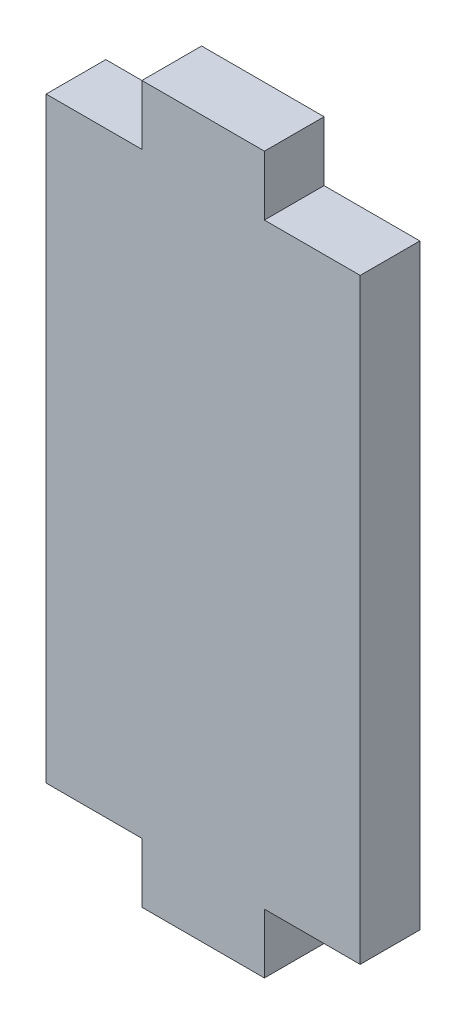
ISO-10303-21;
HEADER;
FILE_DESCRIPTION(('STEP AP214'),'2;1');
FILE_NAME('part.step','',(''),(''),'','','');
FILE_SCHEMA(('AUTOMOTIVE_DESIGN { 1 0 10303 214 1 1 1 1 }'));
ENDSEC;
DATA;
#1=APPLICATION_CONTEXT('core data for automotive mechanical design processes');
#2=APPLICATION_PROTOCOL_DEFINITION('international standard','automotive_design',2000,#1);
#3=PRODUCT_CONTEXT('',#1,'mechanical');
#4=PRODUCT('Part','Part','',(#3));
#5=PRODUCT_RELATED_PRODUCT_CATEGORY('part','',(#4));
#6=PRODUCT_DEFINITION_FORMATION('','',#4);
#7=PRODUCT_DEFINITION_CONTEXT('part definition',#1,'design');
#8=PRODUCT_DEFINITION('design','',#6,#7);
#9=PRODUCT_DEFINITION_SHAPE('','',#8);
#10=(LENGTH_UNIT() NAMED_UNIT(*) SI_UNIT(.MILLI.,.METRE.));
#11=(NAMED_UNIT(*) PLANE_ANGLE_UNIT() SI_UNIT($,.RADIAN.));
#12=(NAMED_UNIT(*) SI_UNIT($,.STERADIAN.) SOLID_ANGLE_UNIT());
#13=UNCERTAINTY_MEASURE_WITH_UNIT(LENGTH_MEASURE(1.E-05),#10,'distance_accuracy_value','');
#14=(GEOMETRIC_REPRESENTATION_CONTEXT(3) GLOBAL_UNCERTAINTY_ASSIGNED_CONTEXT((#13)) GLOBAL_UNIT_ASSIGNED_CONTEXT((#10,
#11,#12)) REPRESENTATION_CONTEXT('',''));
#15=CARTESIAN_POINT('',(0.,0.,0.));
#16=DIRECTION('',(0.,0.,1.));
#17=DIRECTION('',(1.,0.,0.));
#18=AXIS2_PLACEMENT_3D('',#15,#16,#17);
#19=CARTESIAN_POINT('',(0.,0.,4.826));
#20=DIRECTION('',(0.,0.,-1.));
#21=DIRECTION('',(-1.,0.,0.));
#22=AXIS2_PLACEMENT_3D('',#19,#20,#21);
#23=PLANE('',#22);
#24=DIRECTION('',(1.,0.,0.));
#25=VECTOR('',#24,1.);
#26=CARTESIAN_POINT('',(0.,4.826,4.826));
#27=LINE('',#26,#25);
#28=CARTESIAN_POINT('',(0.,4.826,4.826));
#29=VERTEX_POINT('',#28);
#30=CARTESIAN_POINT('',(7.74699999999999,4.826,4.826));
#31=VERTEX_POINT('',#30);
#32=EDGE_CURVE('E50',#29,#31,#27,.T.);
#33=ORIENTED_EDGE('',*,*,#32,.T.);
#34=DIRECTION('',(0.,1.,0.));
#35=VECTOR('',#34,1.);
#36=CARTESIAN_POINT('',(7.74699999999999,0.,4.826));
#37=LINE('',#36,#35);
#38=CARTESIAN_POINT('',(7.74699999999999,0.,4.826));
#39=VERTEX_POINT('',#38);
#40=EDGE_CURVE('E141',#39,#31,#37,.T.);
#41=ORIENTED_EDGE('',*,*,#40,.F.);
#42=DIRECTION('',(1.,0.,0.));
#43=VECTOR('',#42,1.);
#44=CARTESIAN_POINT('',(0.,0.,4.826));
#45=LINE('',#44,#43);
#46=CARTESIAN_POINT('',(17.653,0.,4.826));
#47=VERTEX_POINT('',#46);
#48=EDGE_CURVE('E163',#39,#47,#45,.T.);
#49=ORIENTED_EDGE('',*,*,#48,.T.);
#50=DIRECTION('',(0.,1.,0.));
#51=VECTOR('',#50,1.);
#52=CARTESIAN_POINT('',(17.653,0.,4.826));
#53=LINE('',#52,#51);
#54=CARTESIAN_POINT('',(17.653,4.826,4.826));
#55=VERTEX_POINT('',#54);
#56=EDGE_CURVE('E220',#47,#55,#53,.T.);
#57=ORIENTED_EDGE('',*,*,#56,.T.);
#58=DIRECTION('',(1.,0.,0.));
#59=VECTOR('',#58,1.);
#60=CARTESIAN_POINT('',(0.,4.826,4.826));
#61=LINE('',#60,#59);
#62=CARTESIAN_POINT('',(25.4,4.826,4.826));
#63=VERTEX_POINT('',#62);
#64=EDGE_CURVE('E178',#55,#63,#61,.T.);
#65=ORIENTED_EDGE('',*,*,#64,.T.);
#66=DIRECTION('',(0.,1.,0.));
#67=VECTOR('',#66,1.);
#68=CARTESIAN_POINT('',(25.4,0.,4.826));
#69=LINE('',#68,#67);
#70=CARTESIAN_POINT('',(25.4,53.086,4.826));
#71=VERTEX_POINT('',#70);
#72=EDGE_CURVE('E42',#63,#71,#69,.T.);
#73=ORIENTED_EDGE('',*,*,#72,.T.);
#74=DIRECTION('',(1.,0.,0.));
#75=VECTOR('',#74,1.);
#76=CARTESIAN_POINT('',(0.,53.086,4.826));
#77=LINE('',#76,#75);
#78=CARTESIAN_POINT('',(17.653,53.086,4.826));
#79=VERTEX_POINT('',#78);
#80=EDGE_CURVE('E176',#79,#71,#77,.T.);
#81=ORIENTED_EDGE('',*,*,#80,.F.);
#82=DIRECTION('',(0.,-1.,0.));
#83=VECTOR('',#82,1.);
#84=CARTESIAN_POINT('',(17.6529999999999,0.,4.826));
#85=LINE('',#84,#83);
#86=CARTESIAN_POINT('',(17.653,57.912,4.826));
#87=VERTEX_POINT('',#86);
#88=EDGE_CURVE('E185',#87,#79,#85,.T.);
#89=ORIENTED_EDGE('',*,*,#88,.F.);
#90=DIRECTION('',(-1.,0.,0.));
#91=VECTOR('',#90,1.);
#92=CARTESIAN_POINT('',(0.,57.912,4.826));
#93=LINE('',#92,#91);
#94=CARTESIAN_POINT('',(7.74699999999999,57.912,4.826));
#95=VERTEX_POINT('',#94);
#96=EDGE_CURVE('E11',#87,#95,#93,.T.);
#97=ORIENTED_EDGE('',*,*,#96,.T.);
#98=DIRECTION('',(0.,-1.,0.));
#99=VECTOR('',#98,1.);
#100=CARTESIAN_POINT('',(7.747,0.,4.826));
#101=LINE('',#100,#99);
#102=CARTESIAN_POINT('',(7.74699999999999,53.086,4.826));
#103=VERTEX_POINT('',#102);
#104=EDGE_CURVE('E200',#95,#103,#101,.T.);
#105=ORIENTED_EDGE('',*,*,#104,.T.);
#106=DIRECTION('',(1.,0.,0.));
#107=VECTOR('',#106,1.);
#108=CARTESIAN_POINT('',(0.,53.086,4.826));
#109=LINE('',#108,#107);
#110=CARTESIAN_POINT('',(0.,53.086,4.826));
#111=VERTEX_POINT('',#110);
#112=EDGE_CURVE('E204',#111,#103,#109,.T.);
#113=ORIENTED_EDGE('',*,*,#112,.F.);
#114=DIRECTION('',(0.,-1.,0.));
#115=VECTOR('',#114,1.);
#116=CARTESIAN_POINT('',(0.,0.,4.826));
#117=LINE('',#116,#115);
#118=EDGE_CURVE('E158',#111,#29,#117,.T.);
#119=ORIENTED_EDGE('',*,*,#118,.T.);
#120=EDGE_LOOP('',(#33,#41,#49,#57,#65,#73,#81,#89,#97,#105,#113,#119));
#121=FACE_BOUND('',#120,.T.);
#122=ADVANCED_FACE('F33',(#121),#23,.F.);
#123=CARTESIAN_POINT('',(0.,0.,0.));
#124=DIRECTION('',(0.,0.,-1.));
#125=DIRECTION('',(-1.,0.,0.));
#126=AXIS2_PLACEMENT_3D('',#123,#124,#125);
#127=PLANE('',#126);
#128=DIRECTION('',(0.,1.,0.));
#129=VECTOR('',#128,1.);
#130=CARTESIAN_POINT('',(7.74699999999999,0.,0.));
#131=LINE('',#130,#129);
#132=CARTESIAN_POINT('',(7.74699999999999,0.,0.));
#133=VERTEX_POINT('',#132);
#134=CARTESIAN_POINT('',(7.74699999999999,4.826,0.));
#135=VERTEX_POINT('',#134);
#136=EDGE_CURVE('E132',#133,#135,#131,.T.);
#137=ORIENTED_EDGE('',*,*,#136,.T.);
#138=DIRECTION('',(1.,0.,0.));
#139=VECTOR('',#138,1.);
#140=CARTESIAN_POINT('',(0.,4.826,0.));
#141=LINE('',#140,#139);
#142=CARTESIAN_POINT('',(0.,4.826,0.));
#143=VERTEX_POINT('',#142);
#144=EDGE_CURVE('E125',#143,#135,#141,.T.);
#145=ORIENTED_EDGE('',*,*,#144,.F.);
#146=DIRECTION('',(0.,-1.,0.));
#147=VECTOR('',#146,1.);
#148=CARTESIAN_POINT('',(0.,0.,0.));
#149=LINE('',#148,#147);
#150=CARTESIAN_POINT('',(0.,53.086,0.));
#151=VERTEX_POINT('',#150);
#152=EDGE_CURVE('E139',#151,#143,#149,.T.);
#153=ORIENTED_EDGE('',*,*,#152,.F.);
#154=DIRECTION('',(1.,0.,0.));
#155=VECTOR('',#154,1.);
#156=CARTESIAN_POINT('',(0.,53.086,0.));
#157=LINE('',#156,#155);
#158=CARTESIAN_POINT('',(7.74699999999999,53.086,0.));
#159=VERTEX_POINT('',#158);
#160=EDGE_CURVE('E203',#151,#159,#157,.T.);
#161=ORIENTED_EDGE('',*,*,#160,.T.);
#162=DIRECTION('',(0.,-1.,0.));
#163=VECTOR('',#162,1.);
#164=CARTESIAN_POINT('',(7.747,0.,0.));
#165=LINE('',#164,#163);
#166=CARTESIAN_POINT('',(7.74699999999999,57.912,0.));
#167=VERTEX_POINT('',#166);
#168=EDGE_CURVE('E197',#167,#159,#165,.T.);
#169=ORIENTED_EDGE('',*,*,#168,.F.);
#170=DIRECTION('',(-1.,0.,0.));
#171=VECTOR('',#170,1.);
#172=CARTESIAN_POINT('',(0.,57.912,0.));
#173=LINE('',#172,#171);
#174=CARTESIAN_POINT('',(17.653,57.912,0.));
#175=VERTEX_POINT('',#174);
#176=EDGE_CURVE('E37',#175,#167,#173,.T.);
#177=ORIENTED_EDGE('',*,*,#176,.F.);
#178=DIRECTION('',(0.,-1.,0.));
#179=VECTOR('',#178,1.);
#180=CARTESIAN_POINT('',(17.6529999999999,0.,0.));
#181=LINE('',#180,#179);
#182=CARTESIAN_POINT('',(17.653,53.086,0.));
#183=VERTEX_POINT('',#182);
#184=EDGE_CURVE('E184',#175,#183,#181,.T.);
#185=ORIENTED_EDGE('',*,*,#184,.T.);
#186=DIRECTION('',(1.,0.,0.));
#187=VECTOR('',#186,1.);
#188=CARTESIAN_POINT('',(0.,53.086,0.));
#189=LINE('',#188,#187);
#190=CARTESIAN_POINT('',(25.4,53.086,0.));
#191=VERTEX_POINT('',#190);
#192=EDGE_CURVE('E188',#183,#191,#189,.T.);
#193=ORIENTED_EDGE('',*,*,#192,.T.);
#194=DIRECTION('',(0.,1.,0.));
#195=VECTOR('',#194,1.);
#196=CARTESIAN_POINT('',(25.4,0.,0.));
#197=LINE('',#196,#195);
#198=CARTESIAN_POINT('',(25.4,4.826,0.));
#199=VERTEX_POINT('',#198);
#200=EDGE_CURVE('E148',#199,#191,#197,.T.);
#201=ORIENTED_EDGE('',*,*,#200,.F.);
#202=DIRECTION('',(1.,0.,0.));
#203=VECTOR('',#202,1.);
#204=CARTESIAN_POINT('',(0.,4.826,0.));
#205=LINE('',#204,#203);
#206=CARTESIAN_POINT('',(17.653,4.826,0.));
#207=VERTEX_POINT('',#206);
#208=EDGE_CURVE('E58',#207,#199,#205,.T.);
#209=ORIENTED_EDGE('',*,*,#208,.F.);
#210=DIRECTION('',(0.,1.,0.));
#211=VECTOR('',#210,1.);
#212=CARTESIAN_POINT('',(17.653,0.,0.));
#213=LINE('',#212,#211);
#214=CARTESIAN_POINT('',(17.653,0.,0.));
#215=VERTEX_POINT('',#214);
#216=EDGE_CURVE('E219',#215,#207,#213,.T.);
#217=ORIENTED_EDGE('',*,*,#216,.F.);
#218=DIRECTION('',(1.,0.,0.));
#219=VECTOR('',#218,1.);
#220=CARTESIAN_POINT('',(0.,0.,0.));
#221=LINE('',#220,#219);
#222=EDGE_CURVE('E145',#133,#215,#221,.T.);
#223=ORIENTED_EDGE('',*,*,#222,.F.);
#224=EDGE_LOOP('',(#137,#145,#153,#161,#169,#177,#185,#193,#201,#209,#217,#223));
#225=FACE_BOUND('',#224,.T.);
#226=ADVANCED_FACE('F137',(#225),#127,.T.);
#227=CARTESIAN_POINT('',(0.,0.,4.826));
#228=DIRECTION('',(1.,0.,0.));
#229=DIRECTION('',(0.,0.,-1.));
#230=AXIS2_PLACEMENT_3D('',#227,#228,#229);
#231=PLANE('',#230);
#232=DIRECTION('',(0.,0.,1.));
#233=VECTOR('',#232,1.);
#234=CARTESIAN_POINT('',(0.,4.826,0.));
#235=LINE('',#234,#233);
#236=EDGE_CURVE('E122',#143,#29,#235,.T.);
#237=ORIENTED_EDGE('',*,*,#236,.T.);
#238=ORIENTED_EDGE('',*,*,#118,.F.);
#239=DIRECTION('',(0.,0.,1.));
#240=VECTOR('',#239,1.);
#241=CARTESIAN_POINT('',(0.,53.086,0.));
#242=LINE('',#241,#240);
#243=EDGE_CURVE('E144',#151,#111,#242,.T.);
#244=ORIENTED_EDGE('',*,*,#243,.F.);
#245=ORIENTED_EDGE('',*,*,#152,.T.);
#246=EDGE_LOOP('',(#237,#238,#244,#245));
#247=FACE_BOUND('',#246,.T.);
#248=ADVANCED_FACE('F35',(#247),#231,.F.);
#249=CARTESIAN_POINT('',(0.,0.,4.826));
#250=DIRECTION('',(0.,1.,0.));
#251=DIRECTION('',(0.,0.,1.));
#252=AXIS2_PLACEMENT_3D('',#249,#250,#251);
#253=PLANE('',#252);
#254=ORIENTED_EDGE('',*,*,#48,.F.);
#255=DIRECTION('',(0.,0.,1.));
#256=VECTOR('',#255,1.);
#257=CARTESIAN_POINT('',(7.74699999999999,0.,0.));
#258=LINE('',#257,#256);
#259=EDGE_CURVE('E131',#133,#39,#258,.T.);
#260=ORIENTED_EDGE('',*,*,#259,.F.);
#261=ORIENTED_EDGE('',*,*,#222,.T.);
#262=DIRECTION('',(0.,0.,1.));
#263=VECTOR('',#262,1.);
#264=CARTESIAN_POINT('',(17.653,0.,0.));
#265=LINE('',#264,#263);
#266=EDGE_CURVE('E211',#215,#47,#265,.T.);
#267=ORIENTED_EDGE('',*,*,#266,.T.);
#268=EDGE_LOOP('',(#254,#260,#261,#267));
#269=FACE_BOUND('',#268,.T.);
#270=ADVANCED_FACE('F236',(#269),#253,.F.);
#271=CARTESIAN_POINT('',(25.4,0.,4.826));
#272=DIRECTION('',(-1.,0.,0.));
#273=DIRECTION('',(0.,0.,1.));
#274=AXIS2_PLACEMENT_3D('',#271,#272,#273);
#275=PLANE('',#274);
#276=DIRECTION('',(0.,0.,1.));
#277=VECTOR('',#276,1.);
#278=CARTESIAN_POINT('',(25.4,4.826,0.));
#279=LINE('',#278,#277);
#280=EDGE_CURVE('E214',#199,#63,#279,.T.);
#281=ORIENTED_EDGE('',*,*,#280,.F.);
#282=ORIENTED_EDGE('',*,*,#200,.T.);
#283=DIRECTION('',(0.,0.,1.));
#284=VECTOR('',#283,1.);
#285=CARTESIAN_POINT('',(25.4,53.086,0.));
#286=LINE('',#285,#284);
#287=EDGE_CURVE('E150',#191,#71,#286,.T.);
#288=ORIENTED_EDGE('',*,*,#287,.T.);
#289=ORIENTED_EDGE('',*,*,#72,.F.);
#290=EDGE_LOOP('',(#281,#282,#288,#289));
#291=FACE_BOUND('',#290,.T.);
#292=ADVANCED_FACE('F187',(#291),#275,.F.);
#293=CARTESIAN_POINT('',(0.,57.912,4.826));
#294=DIRECTION('',(0.,-1.,0.));
#295=DIRECTION('',(0.,0.,-1.));
#296=AXIS2_PLACEMENT_3D('',#293,#294,#295);
#297=PLANE('',#296);
#298=DIRECTION('',(0.,0.,1.));
#299=VECTOR('',#298,1.);
#300=CARTESIAN_POINT('',(7.74699999999999,57.912,0.));
#301=LINE('',#300,#299);
#302=EDGE_CURVE('E191',#167,#95,#301,.T.);
#303=ORIENTED_EDGE('',*,*,#302,.T.);
#304=ORIENTED_EDGE('',*,*,#96,.F.);
#305=DIRECTION('',(0.,0.,1.));
#306=VECTOR('',#305,1.);
#307=CARTESIAN_POINT('',(17.653,57.912,0.));
#308=LINE('',#307,#306);
#309=EDGE_CURVE('E146',#175,#87,#308,.T.);
#310=ORIENTED_EDGE('',*,*,#309,.F.);
#311=ORIENTED_EDGE('',*,*,#176,.T.);
#312=EDGE_LOOP('',(#303,#304,#310,#311));
#313=FACE_BOUND('',#312,.T.);
#314=ADVANCED_FACE('F245',(#313),#297,.F.);
#315=CARTESIAN_POINT('',(17.6529999999999,0.,0.));
#316=DIRECTION('',(-1.,0.,0.));
#317=DIRECTION('',(0.,-1.,0.));
#318=AXIS2_PLACEMENT_3D('',#315,#316,#317);
#319=PLANE('',#318);
#320=ORIENTED_EDGE('',*,*,#88,.T.);
#321=DIRECTION('',(0.,0.,1.));
#322=VECTOR('',#321,1.);
#323=CARTESIAN_POINT('',(17.653,53.086,0.));
#324=LINE('',#323,#322);
#325=EDGE_CURVE('E169',#183,#79,#324,.T.);
#326=ORIENTED_EDGE('',*,*,#325,.F.);
#327=ORIENTED_EDGE('',*,*,#184,.F.);
#328=ORIENTED_EDGE('',*,*,#309,.T.);
#329=EDGE_LOOP('',(#320,#326,#327,#328));
#330=FACE_BOUND('',#329,.T.);
#331=ADVANCED_FACE('F243',(#330),#319,.F.);
#332=CARTESIAN_POINT('',(0.,53.086,0.));
#333=DIRECTION('',(0.,-1.,0.));
#334=DIRECTION('',(0.,0.,-1.));
#335=AXIS2_PLACEMENT_3D('',#332,#333,#334);
#336=PLANE('',#335);
#337=ORIENTED_EDGE('',*,*,#80,.T.);
#338=ORIENTED_EDGE('',*,*,#287,.F.);
#339=ORIENTED_EDGE('',*,*,#192,.F.);
#340=ORIENTED_EDGE('',*,*,#325,.T.);
#341=EDGE_LOOP('',(#337,#338,#339,#340));
#342=FACE_BOUND('',#341,.T.);
#343=ADVANCED_FACE('F180',(#342),#336,.F.);
#344=CARTESIAN_POINT('',(7.747,0.,0.));
#345=DIRECTION('',(-1.,0.,0.));
#346=DIRECTION('',(0.,-1.,0.));
#347=AXIS2_PLACEMENT_3D('',#344,#345,#346);
#348=PLANE('',#347);
#349=ORIENTED_EDGE('',*,*,#104,.F.);
#350=ORIENTED_EDGE('',*,*,#302,.F.);
#351=ORIENTED_EDGE('',*,*,#168,.T.);
#352=DIRECTION('',(0.,0.,1.));
#353=VECTOR('',#352,1.);
#354=CARTESIAN_POINT('',(7.74699999999999,53.086,0.));
#355=LINE('',#354,#353);
#356=EDGE_CURVE('E196',#159,#103,#355,.T.);
#357=ORIENTED_EDGE('',*,*,#356,.T.);
#358=EDGE_LOOP('',(#349,#350,#351,#357));
#359=FACE_BOUND('',#358,.T.);
#360=ADVANCED_FACE('F247',(#359),#348,.T.);
#361=CARTESIAN_POINT('',(0.,53.086,0.));
#362=DIRECTION('',(0.,-1.,0.));
#363=DIRECTION('',(0.,0.,-1.));
#364=AXIS2_PLACEMENT_3D('',#361,#362,#363);
#365=PLANE('',#364);
#366=ORIENTED_EDGE('',*,*,#112,.T.);
#367=ORIENTED_EDGE('',*,*,#356,.F.);
#368=ORIENTED_EDGE('',*,*,#160,.F.);
#369=ORIENTED_EDGE('',*,*,#243,.T.);
#370=EDGE_LOOP('',(#366,#367,#368,#369));
#371=FACE_BOUND('',#370,.T.);
#372=ADVANCED_FACE('F249',(#371),#365,.F.);
#373=CARTESIAN_POINT('',(17.653,0.,0.));
#374=DIRECTION('',(1.,0.,0.));
#375=DIRECTION('',(0.,1.,0.));
#376=AXIS2_PLACEMENT_3D('',#373,#374,#375);
#377=PLANE('',#376);
#378=ORIENTED_EDGE('',*,*,#56,.F.);
#379=ORIENTED_EDGE('',*,*,#266,.F.);
#380=ORIENTED_EDGE('',*,*,#216,.T.);
#381=DIRECTION('',(0.,0.,1.));
#382=VECTOR('',#381,1.);
#383=CARTESIAN_POINT('',(17.653,4.826,0.));
#384=LINE('',#383,#382);
#385=EDGE_CURVE('E207',#207,#55,#384,.T.);
#386=ORIENTED_EDGE('',*,*,#385,.T.);
#387=EDGE_LOOP('',(#378,#379,#380,#386));
#388=FACE_BOUND('',#387,.T.);
#389=ADVANCED_FACE('F240',(#388),#377,.T.);
#390=CARTESIAN_POINT('',(0.,4.826,0.));
#391=DIRECTION('',(0.,-1.,0.));
#392=DIRECTION('',(0.,0.,-1.));
#393=AXIS2_PLACEMENT_3D('',#390,#391,#392);
#394=PLANE('',#393);
#395=ORIENTED_EDGE('',*,*,#64,.F.);
#396=ORIENTED_EDGE('',*,*,#385,.F.);
#397=ORIENTED_EDGE('',*,*,#208,.T.);
#398=ORIENTED_EDGE('',*,*,#280,.T.);
#399=EDGE_LOOP('',(#395,#396,#397,#398));
#400=FACE_BOUND('',#399,.T.);
#401=ADVANCED_FACE('F256',(#400),#394,.T.);
#402=CARTESIAN_POINT('',(0.,4.826,0.));
#403=DIRECTION('',(0.,-1.,0.));
#404=DIRECTION('',(0.,0.,-1.));
#405=AXIS2_PLACEMENT_3D('',#402,#403,#404);
#406=PLANE('',#405);
#407=ORIENTED_EDGE('',*,*,#32,.F.);
#408=ORIENTED_EDGE('',*,*,#236,.F.);
#409=ORIENTED_EDGE('',*,*,#144,.T.);
#410=DIRECTION('',(0.,0.,1.));
#411=VECTOR('',#410,1.);
#412=CARTESIAN_POINT('',(7.74699999999999,4.826,0.));
#413=LINE('',#412,#411);
#414=EDGE_CURVE('E222',#135,#31,#413,.T.);
#415=ORIENTED_EDGE('',*,*,#414,.T.);
#416=EDGE_LOOP('',(#407,#408,#409,#415));
#417=FACE_BOUND('',#416,.T.);
#418=ADVANCED_FACE('F124',(#417),#406,.T.);
#419=CARTESIAN_POINT('',(7.74699999999999,0.,0.));
#420=DIRECTION('',(1.,0.,0.));
#421=DIRECTION('',(0.,1.,0.));
#422=AXIS2_PLACEMENT_3D('',#419,#420,#421);
#423=PLANE('',#422);
#424=ORIENTED_EDGE('',*,*,#40,.T.);
#425=ORIENTED_EDGE('',*,*,#414,.F.);
#426=ORIENTED_EDGE('',*,*,#136,.F.);
#427=ORIENTED_EDGE('',*,*,#259,.T.);
#428=EDGE_LOOP('',(#424,#425,#426,#427));
#429=FACE_BOUND('',#428,.T.);
#430=ADVANCED_FACE('F338',(#429),#423,.F.);
#431=CLOSED_SHELL('',(#122,#226,#248,#270,#292,#314,#331,#343,#360,#372,#389,#401,#418,#430));
#432=MANIFOLD_SOLID_BREP('B2',#431);
#433=ADVANCED_BREP_SHAPE_REPRESENTATION('',(#18,#432),#14);
#434=SHAPE_DEFINITION_REPRESENTATION(#9,#433);
ENDSEC;
END-ISO-10303-21;
